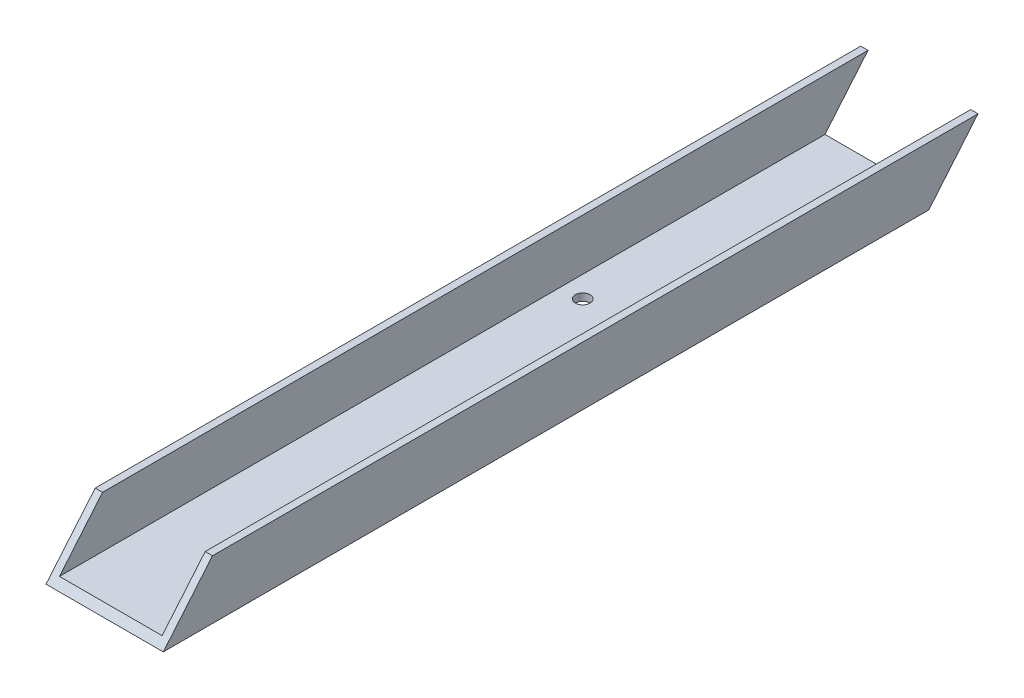
ISO-10303-21;
HEADER;
FILE_DESCRIPTION(('STEP AP214'),'2;1');
FILE_NAME('part.step','',(''),(''),'','','');
FILE_SCHEMA(('AUTOMOTIVE_DESIGN { 1 0 10303 214 1 1 1 1 }'));
ENDSEC;
DATA;
#1=APPLICATION_CONTEXT('core data for automotive mechanical design processes');
#2=APPLICATION_PROTOCOL_DEFINITION('international standard','automotive_design',2000,#1);
#3=PRODUCT_CONTEXT('',#1,'mechanical');
#4=PRODUCT('Part','Part','',(#3));
#5=PRODUCT_RELATED_PRODUCT_CATEGORY('part','',(#4));
#6=PRODUCT_DEFINITION_FORMATION('','',#4);
#7=PRODUCT_DEFINITION_CONTEXT('part definition',#1,'design');
#8=PRODUCT_DEFINITION('design','',#6,#7);
#9=PRODUCT_DEFINITION_SHAPE('','',#8);
#10=(LENGTH_UNIT() NAMED_UNIT(*) SI_UNIT(.MILLI.,.METRE.));
#11=(NAMED_UNIT(*) PLANE_ANGLE_UNIT() SI_UNIT($,.RADIAN.));
#12=(NAMED_UNIT(*) SI_UNIT($,.STERADIAN.) SOLID_ANGLE_UNIT());
#13=UNCERTAINTY_MEASURE_WITH_UNIT(LENGTH_MEASURE(1.E-05),#10,'distance_accuracy_value','');
#14=(GEOMETRIC_REPRESENTATION_CONTEXT(3) GLOBAL_UNCERTAINTY_ASSIGNED_CONTEXT((#13)) GLOBAL_UNIT_ASSIGNED_CONTEXT((#10,
#11,#12)) REPRESENTATION_CONTEXT('',''));
#15=CARTESIAN_POINT('',(0.,0.,0.));
#16=DIRECTION('',(0.,0.,1.));
#17=DIRECTION('',(1.,0.,0.));
#18=AXIS2_PLACEMENT_3D('',#15,#16,#17);
#19=CARTESIAN_POINT('',(0.,0.,457.2));
#20=DIRECTION('',(1.,0.,0.));
#21=DIRECTION('',(0.,0.,-1.));
#22=AXIS2_PLACEMENT_3D('',#19,#20,#21);
#23=PLANE('',#22);
#24=DIRECTION('',(0.,0.,-1.));
#25=VECTOR('',#24,1.);
#26=CARTESIAN_POINT('',(0.,0.,457.2));
#27=LINE('',#26,#25);
#28=CARTESIAN_POINT('',(0.,0.,352.886582122302));
#29=VERTEX_POINT('',#28);
#30=CARTESIAN_POINT('',(0.,0.,21.3131306319032));
#31=VERTEX_POINT('',#30);
#32=EDGE_CURVE('E11',#29,#31,#27,.T.);
#33=ORIENTED_EDGE('',*,*,#32,.F.);
#34=DIRECTION('',(0.,0.766044443118974,-0.642787609686544));
#35=VECTOR('',#34,1.);
#36=CARTESIAN_POINT('',(0.,0.,352.886582122302));
#37=LINE('',#36,#35);
#38=CARTESIAN_POINT('',(0.,25.4,331.573451490399));
#39=VERTEX_POINT('',#38);
#40=EDGE_CURVE('E106',#29,#39,#37,.T.);
#41=ORIENTED_EDGE('',*,*,#40,.T.);
#42=DIRECTION('',(0.,0.,-1.));
#43=VECTOR('',#42,1.);
#44=CARTESIAN_POINT('',(0.,25.4,457.2));
#45=LINE('',#44,#43);
#46=CARTESIAN_POINT('',(0.,25.4,0.));
#47=VERTEX_POINT('',#46);
#48=EDGE_CURVE('E127',#39,#47,#45,.T.);
#49=ORIENTED_EDGE('',*,*,#48,.T.);
#50=DIRECTION('',(0.,0.766044443118974,-0.642787609686544));
#51=VECTOR('',#50,1.);
#52=CARTESIAN_POINT('',(0.,25.4,0.));
#53=LINE('',#52,#51);
#54=EDGE_CURVE('E126',#31,#47,#53,.T.);
#55=ORIENTED_EDGE('',*,*,#54,.F.);
#56=EDGE_LOOP('',(#33,#41,#49,#55));
#57=FACE_BOUND('',#56,.T.);
#58=ADVANCED_FACE('F38',(#57),#23,.F.);
#59=CARTESIAN_POINT('',(0.,0.,457.2));
#60=DIRECTION('',(0.,1.,0.));
#61=DIRECTION('',(0.,0.,1.));
#62=AXIS2_PLACEMENT_3D('',#59,#60,#61);
#63=PLANE('',#62);
#64=CARTESIAN_POINT('',(12.3849085783578,0.,132.818754660483));
#65=DIRECTION('',(0.,1.,0.));
#66=DIRECTION('',(0.,0.,1.));
#67=AXIS2_PLACEMENT_3D('',#64,#65,#66);
#68=CIRCLE('',#67,3.17500000000001);
#69=CARTESIAN_POINT('',(12.3849085783578,0.,135.993754660483));
#70=VERTEX_POINT('',#69);
#71=EDGE_CURVE('E158',#70,#70,#68,.F.);
#72=ORIENTED_EDGE('',*,*,#71,.F.);
#73=EDGE_LOOP('',(#72));
#74=FACE_BOUND('',#73,.T.);
#75=DIRECTION('',(0.,0.,-1.));
#76=VECTOR('',#75,1.);
#77=CARTESIAN_POINT('',(50.8,0.,457.2));
#78=LINE('',#77,#76);
#79=CARTESIAN_POINT('',(50.8,0.,352.886582122302));
#80=VERTEX_POINT('',#79);
#81=CARTESIAN_POINT('',(50.8,0.,21.3131306319032));
#82=VERTEX_POINT('',#81);
#83=EDGE_CURVE('E46',#80,#82,#78,.T.);
#84=ORIENTED_EDGE('',*,*,#83,.F.);
#85=DIRECTION('',(1.,0.,0.));
#86=VECTOR('',#85,1.);
#87=CARTESIAN_POINT('',(0.,0.,352.886582122302));
#88=LINE('',#87,#86);
#89=EDGE_CURVE('E109',#29,#80,#88,.T.);
#90=ORIENTED_EDGE('',*,*,#89,.F.);
#91=ORIENTED_EDGE('',*,*,#32,.T.);
#92=DIRECTION('',(-1.,0.,0.));
#93=VECTOR('',#92,1.);
#94=CARTESIAN_POINT('',(50.8,0.,21.3131306319032));
#95=LINE('',#94,#93);
#96=EDGE_CURVE('E138',#82,#31,#95,.T.);
#97=ORIENTED_EDGE('',*,*,#96,.F.);
#98=EDGE_LOOP('',(#84,#90,#91,#97));
#99=FACE_BOUND('',#98,.T.);
#100=ADVANCED_FACE('F119',(#74,#99),#63,.F.);
#101=CARTESIAN_POINT('',(50.8,0.,457.2));
#102=DIRECTION('',(-1.,0.,0.));
#103=DIRECTION('',(0.,0.,1.));
#104=AXIS2_PLACEMENT_3D('',#101,#102,#103);
#105=PLANE('',#104);
#106=DIRECTION('',(0.,0.,-1.));
#107=VECTOR('',#106,1.);
#108=CARTESIAN_POINT('',(50.8,25.4,457.2));
#109=LINE('',#108,#107);
#110=CARTESIAN_POINT('',(50.8,25.4,331.573451490399));
#111=VERTEX_POINT('',#110);
#112=CARTESIAN_POINT('',(50.8,25.4,0.));
#113=VERTEX_POINT('',#112);
#114=EDGE_CURVE('E180',#111,#113,#109,.T.);
#115=ORIENTED_EDGE('',*,*,#114,.F.);
#116=DIRECTION('',(0.,0.766044443118974,-0.642787609686544));
#117=VECTOR('',#116,1.);
#118=CARTESIAN_POINT('',(50.8,0.,352.886582122302));
#119=LINE('',#118,#117);
#120=EDGE_CURVE('E115',#80,#111,#119,.T.);
#121=ORIENTED_EDGE('',*,*,#120,.F.);
#122=ORIENTED_EDGE('',*,*,#83,.T.);
#123=DIRECTION('',(0.,0.766044443118974,-0.642787609686544));
#124=VECTOR('',#123,1.);
#125=CARTESIAN_POINT('',(50.8,25.4,0.));
#126=LINE('',#125,#124);
#127=EDGE_CURVE('E132',#82,#113,#126,.T.);
#128=ORIENTED_EDGE('',*,*,#127,.T.);
#129=EDGE_LOOP('',(#115,#121,#122,#128));
#130=FACE_BOUND('',#129,.T.);
#131=ADVANCED_FACE('F185',(#130),#105,.F.);
#132=CARTESIAN_POINT('',(47.625,25.4,457.2));
#133=DIRECTION('',(0.,-1.,0.));
#134=DIRECTION('',(0.,0.,-1.));
#135=AXIS2_PLACEMENT_3D('',#132,#133,#134);
#136=PLANE('',#135);
#137=DIRECTION('',(0.,0.,-1.));
#138=VECTOR('',#137,1.);
#139=CARTESIAN_POINT('',(47.625,25.4,457.2));
#140=LINE('',#139,#138);
#141=CARTESIAN_POINT('',(47.625,25.4,331.573451490399));
#142=VERTEX_POINT('',#141);
#143=CARTESIAN_POINT('',(47.625,25.4,0.));
#144=VERTEX_POINT('',#143);
#145=EDGE_CURVE('E64',#142,#144,#140,.T.);
#146=ORIENTED_EDGE('',*,*,#145,.F.);
#147=DIRECTION('',(1.,0.,0.));
#148=VECTOR('',#147,1.);
#149=CARTESIAN_POINT('',(0.,25.4,331.573451490399));
#150=LINE('',#149,#148);
#151=EDGE_CURVE('E122',#142,#111,#150,.T.);
#152=ORIENTED_EDGE('',*,*,#151,.T.);
#153=ORIENTED_EDGE('',*,*,#114,.T.);
#154=DIRECTION('',(-1.,0.,0.));
#155=VECTOR('',#154,1.);
#156=CARTESIAN_POINT('',(47.625,25.4,0.));
#157=LINE('',#156,#155);
#158=EDGE_CURVE('E161',#113,#144,#157,.T.);
#159=ORIENTED_EDGE('',*,*,#158,.T.);
#160=EDGE_LOOP('',(#146,#152,#153,#159));
#161=FACE_BOUND('',#160,.T.);
#162=ADVANCED_FACE('F190',(#161),#136,.F.);
#163=CARTESIAN_POINT('',(47.625,3.175,457.2));
#164=DIRECTION('',(1.,0.,0.));
#165=DIRECTION('',(0.,0.,-1.));
#166=AXIS2_PLACEMENT_3D('',#163,#164,#165);
#167=PLANE('',#166);
#168=DIRECTION('',(0.,0.,-1.));
#169=VECTOR('',#168,1.);
#170=CARTESIAN_POINT('',(47.625,3.175,457.2));
#171=LINE('',#170,#169);
#172=CARTESIAN_POINT('',(47.625,3.175,350.222440793314));
#173=VERTEX_POINT('',#172);
#174=CARTESIAN_POINT('',(47.625,3.175,18.6489893029153));
#175=VERTEX_POINT('',#174);
#176=EDGE_CURVE('E175',#173,#175,#171,.T.);
#177=ORIENTED_EDGE('',*,*,#176,.F.);
#178=DIRECTION('',(0.,0.766044443118974,-0.642787609686544));
#179=VECTOR('',#178,1.);
#180=CARTESIAN_POINT('',(47.625,-49.5011648525336,394.422991292909));
#181=LINE('',#180,#179);
#182=EDGE_CURVE('E133',#173,#142,#181,.T.);
#183=ORIENTED_EDGE('',*,*,#182,.T.);
#184=ORIENTED_EDGE('',*,*,#145,.T.);
#185=DIRECTION('',(0.,-0.766044443118975,0.642787609686544));
#186=VECTOR('',#185,1.);
#187=CARTESIAN_POINT('',(47.625,-212.769217712915,199.84770274069));
#188=LINE('',#187,#186);
#189=EDGE_CURVE('E152',#144,#175,#188,.T.);
#190=ORIENTED_EDGE('',*,*,#189,.T.);
#191=EDGE_LOOP('',(#177,#183,#184,#190));
#192=FACE_BOUND('',#191,.T.);
#193=ADVANCED_FACE('F201',(#192),#167,.F.);
#194=CARTESIAN_POINT('',(3.175,3.175,457.2));
#195=DIRECTION('',(0.,-1.,0.));
#196=DIRECTION('',(0.,0.,-1.));
#197=AXIS2_PLACEMENT_3D('',#194,#195,#196);
#198=PLANE('',#197);
#199=CARTESIAN_POINT('',(12.3849085783578,3.175,132.818754660483));
#200=DIRECTION('',(0.,1.,0.));
#201=DIRECTION('',(0.,0.,1.));
#202=AXIS2_PLACEMENT_3D('',#199,#200,#201);
#203=CIRCLE('',#202,3.17500000000001);
#204=CARTESIAN_POINT('',(12.3849085783578,3.175,135.993754660483));
#205=VERTEX_POINT('',#204);
#206=EDGE_CURVE('E155',#205,#205,#203,.T.);
#207=ORIENTED_EDGE('',*,*,#206,.F.);
#208=EDGE_LOOP('',(#207));
#209=FACE_BOUND('',#208,.T.);
#210=DIRECTION('',(0.,0.,-1.));
#211=VECTOR('',#210,1.);
#212=CARTESIAN_POINT('',(3.175,3.175,457.2));
#213=LINE('',#212,#211);
#214=CARTESIAN_POINT('',(3.175,3.175,350.222440793314));
#215=VERTEX_POINT('',#214);
#216=CARTESIAN_POINT('',(3.175,3.17499999999998,18.6489893029153));
#217=VERTEX_POINT('',#216);
#218=EDGE_CURVE('E172',#215,#217,#213,.T.);
#219=ORIENTED_EDGE('',*,*,#218,.F.);
#220=DIRECTION('',(1.,0.,0.));
#221=VECTOR('',#220,1.);
#222=CARTESIAN_POINT('',(3.175,3.175,350.222440793314));
#223=LINE('',#222,#221);
#224=EDGE_CURVE('E140',#215,#173,#223,.T.);
#225=ORIENTED_EDGE('',*,*,#224,.T.);
#226=ORIENTED_EDGE('',*,*,#176,.T.);
#227=DIRECTION('',(-1.,0.,0.));
#228=VECTOR('',#227,1.);
#229=CARTESIAN_POINT('',(3.175,3.175,18.6489893029153));
#230=LINE('',#229,#228);
#231=EDGE_CURVE('E148',#175,#217,#230,.T.);
#232=ORIENTED_EDGE('',*,*,#231,.T.);
#233=EDGE_LOOP('',(#219,#225,#226,#232));
#234=FACE_BOUND('',#233,.T.);
#235=ADVANCED_FACE('F200',(#209,#234),#198,.F.);
#236=CARTESIAN_POINT('',(3.175,3.175,457.2));
#237=DIRECTION('',(-1.,0.,0.));
#238=DIRECTION('',(0.,-1.,0.));
#239=AXIS2_PLACEMENT_3D('',#236,#237,#238);
#240=PLANE('',#239);
#241=DIRECTION('',(0.,0.,-1.));
#242=VECTOR('',#241,1.);
#243=CARTESIAN_POINT('',(3.175,25.4,457.2));
#244=LINE('',#243,#242);
#245=CARTESIAN_POINT('',(3.175,25.4,331.573451490399));
#246=VERTEX_POINT('',#245);
#247=CARTESIAN_POINT('',(3.175,25.4,0.));
#248=VERTEX_POINT('',#247);
#249=EDGE_CURVE('E169',#246,#248,#244,.T.);
#250=ORIENTED_EDGE('',*,*,#249,.F.);
#251=DIRECTION('',(0.,-0.766044443118974,0.642787609686544));
#252=VECTOR('',#251,1.);
#253=CARTESIAN_POINT('',(3.175,-49.5011648525336,394.422991292909));
#254=LINE('',#253,#252);
#255=EDGE_CURVE('E53',#246,#215,#254,.T.);
#256=ORIENTED_EDGE('',*,*,#255,.T.);
#257=ORIENTED_EDGE('',*,*,#218,.T.);
#258=DIRECTION('',(0.,0.766044443118975,-0.642787609686544));
#259=VECTOR('',#258,1.);
#260=CARTESIAN_POINT('',(3.175,-212.769217712915,199.84770274069));
#261=LINE('',#260,#259);
#262=EDGE_CURVE('E144',#217,#248,#261,.T.);
#263=ORIENTED_EDGE('',*,*,#262,.T.);
#264=EDGE_LOOP('',(#250,#256,#257,#263));
#265=FACE_BOUND('',#264,.T.);
#266=ADVANCED_FACE('F208',(#265),#240,.F.);
#267=CARTESIAN_POINT('',(0.,25.4,457.2));
#268=DIRECTION('',(0.,-1.,0.));
#269=DIRECTION('',(0.,0.,-1.));
#270=AXIS2_PLACEMENT_3D('',#267,#268,#269);
#271=PLANE('',#270);
#272=ORIENTED_EDGE('',*,*,#48,.F.);
#273=EDGE_CURVE('E111',#39,#246,#150,.T.);
#274=ORIENTED_EDGE('',*,*,#273,.T.);
#275=ORIENTED_EDGE('',*,*,#249,.T.);
#276=DIRECTION('',(-1.,0.,0.));
#277=VECTOR('',#276,1.);
#278=CARTESIAN_POINT('',(0.,25.4,0.));
#279=LINE('',#278,#277);
#280=EDGE_CURVE('E165',#248,#47,#279,.T.);
#281=ORIENTED_EDGE('',*,*,#280,.T.);
#282=EDGE_LOOP('',(#272,#274,#275,#281));
#283=FACE_BOUND('',#282,.T.);
#284=ADVANCED_FACE('F225',(#283),#271,.F.);
#285=CARTESIAN_POINT('',(12.3849085783578,-0.00100000000000013,132.818754660483));
#286=DIRECTION('',(0.,1.,0.));
#287=DIRECTION('',(0.,0.,1.));
#288=AXIS2_PLACEMENT_3D('',#285,#286,#287);
#289=CYLINDRICAL_SURFACE('',#288,3.17500000000001);
#290=ORIENTED_EDGE('',*,*,#206,.T.);
#291=EDGE_LOOP('',(#290));
#292=FACE_BOUND('',#291,.T.);
#293=ORIENTED_EDGE('',*,*,#71,.T.);
#294=EDGE_LOOP('',(#293));
#295=FACE_BOUND('',#294,.T.);
#296=ADVANCED_FACE('F223',(#292,#295),#289,.F.);
#297=CARTESIAN_POINT('',(50.8,25.4,0.));
#298=DIRECTION('',(0.,0.642787609686544,0.766044443118974));
#299=DIRECTION('',(0.,-0.766044443118975,0.642787609686544));
#300=AXIS2_PLACEMENT_3D('',#297,#298,#299);
#301=PLANE('',#300);
#302=ORIENTED_EDGE('',*,*,#158,.F.);
#303=ORIENTED_EDGE('',*,*,#127,.F.);
#304=ORIENTED_EDGE('',*,*,#96,.T.);
#305=ORIENTED_EDGE('',*,*,#54,.T.);
#306=ORIENTED_EDGE('',*,*,#280,.F.);
#307=ORIENTED_EDGE('',*,*,#262,.F.);
#308=ORIENTED_EDGE('',*,*,#231,.F.);
#309=ORIENTED_EDGE('',*,*,#189,.F.);
#310=EDGE_LOOP('',(#302,#303,#304,#305,#306,#307,#308,#309));
#311=FACE_BOUND('',#310,.T.);
#312=ADVANCED_FACE('F187',(#311),#301,.F.);
#313=CARTESIAN_POINT('',(0.,0.,352.886582122302));
#314=DIRECTION('',(0.,-0.642787609686544,-0.766044443118974));
#315=DIRECTION('',(0.,0.766044443118974,-0.642787609686544));
#316=AXIS2_PLACEMENT_3D('',#313,#314,#315);
#317=PLANE('',#316);
#318=ORIENTED_EDGE('',*,*,#224,.F.);
#319=ORIENTED_EDGE('',*,*,#255,.F.);
#320=ORIENTED_EDGE('',*,*,#273,.F.);
#321=ORIENTED_EDGE('',*,*,#40,.F.);
#322=ORIENTED_EDGE('',*,*,#89,.T.);
#323=ORIENTED_EDGE('',*,*,#120,.T.);
#324=ORIENTED_EDGE('',*,*,#151,.F.);
#325=ORIENTED_EDGE('',*,*,#182,.F.);
#326=EDGE_LOOP('',(#318,#319,#320,#321,#322,#323,#324,#325));
#327=FACE_BOUND('',#326,.T.);
#328=ADVANCED_FACE('F108',(#327),#317,.F.);
#329=CLOSED_SHELL('',(#58,#100,#131,#162,#193,#235,#266,#284,#296,#312,#328));
#330=MANIFOLD_SOLID_BREP('B2',#329);
#331=ADVANCED_BREP_SHAPE_REPRESENTATION('',(#18,#330),#14);
#332=SHAPE_DEFINITION_REPRESENTATION(#9,#331);
ENDSEC;
END-ISO-10303-21;
